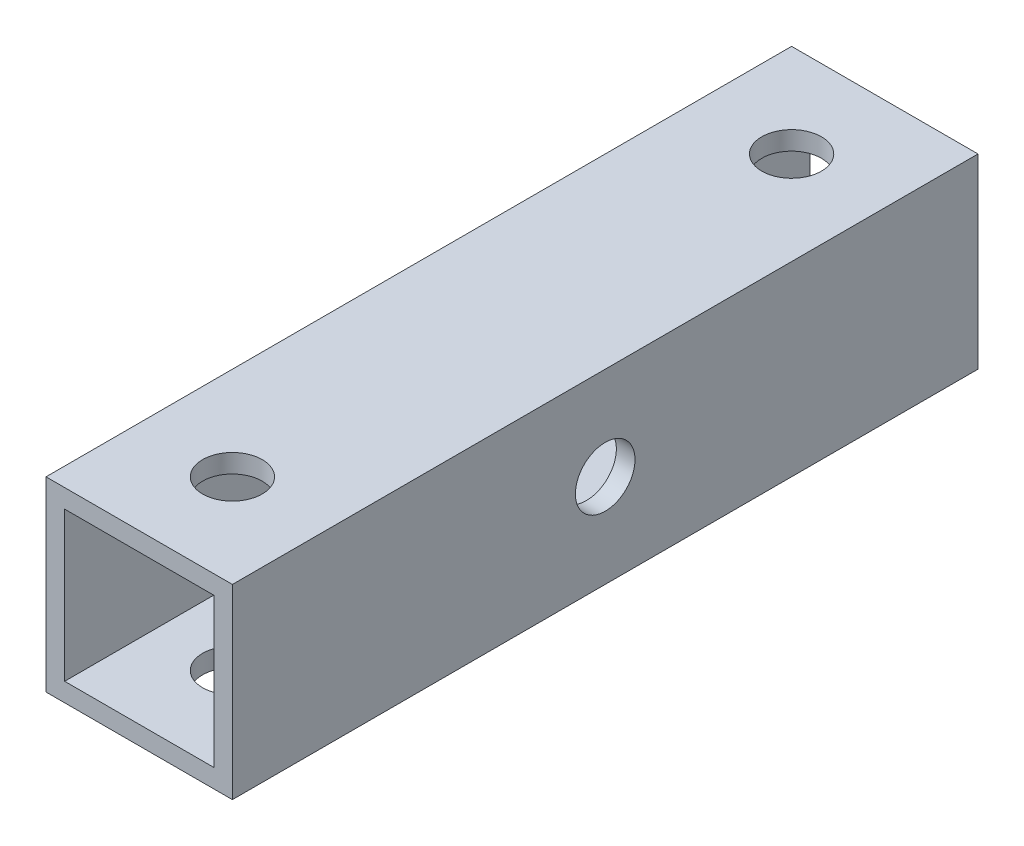
ISO-10303-21;
HEADER;
FILE_DESCRIPTION(('STEP AP214'),'2;1');
FILE_NAME('part.step','',(''),(''),'','','');
FILE_SCHEMA(('AUTOMOTIVE_DESIGN { 1 0 10303 214 1 1 1 1 }'));
ENDSEC;
DATA;
#1=APPLICATION_CONTEXT('core data for automotive mechanical design processes');
#2=APPLICATION_PROTOCOL_DEFINITION('international standard','automotive_design',2000,#1);
#3=PRODUCT_CONTEXT('',#1,'mechanical');
#4=PRODUCT('Part','Part','',(#3));
#5=PRODUCT_RELATED_PRODUCT_CATEGORY('part','',(#4));
#6=PRODUCT_DEFINITION_FORMATION('','',#4);
#7=PRODUCT_DEFINITION_CONTEXT('part definition',#1,'design');
#8=PRODUCT_DEFINITION('design','',#6,#7);
#9=PRODUCT_DEFINITION_SHAPE('','',#8);
#10=(LENGTH_UNIT() NAMED_UNIT(*) SI_UNIT(.MILLI.,.METRE.));
#11=(NAMED_UNIT(*) PLANE_ANGLE_UNIT() SI_UNIT($,.RADIAN.));
#12=(NAMED_UNIT(*) SI_UNIT($,.STERADIAN.) SOLID_ANGLE_UNIT());
#13=UNCERTAINTY_MEASURE_WITH_UNIT(LENGTH_MEASURE(1.E-05),#10,'distance_accuracy_value','');
#14=(GEOMETRIC_REPRESENTATION_CONTEXT(3) GLOBAL_UNCERTAINTY_ASSIGNED_CONTEXT((#13)) GLOBAL_UNIT_ASSIGNED_CONTEXT((#10,
#11,#12)) REPRESENTATION_CONTEXT('',''));
#15=CARTESIAN_POINT('',(0.,0.,0.));
#16=DIRECTION('',(0.,0.,1.));
#17=DIRECTION('',(1.,0.,0.));
#18=AXIS2_PLACEMENT_3D('',#15,#16,#17);
#19=CARTESIAN_POINT('',(0.,0.,40.));
#20=DIRECTION('',(0.,0.,1.));
#21=DIRECTION('',(1.,0.,0.));
#22=AXIS2_PLACEMENT_3D('',#19,#20,#21);
#23=PLANE('',#22);
#24=DIRECTION('',(0.,1.,0.));
#25=VECTOR('',#24,1.);
#26=CARTESIAN_POINT('',(5.,5.,40.));
#27=LINE('',#26,#25);
#28=CARTESIAN_POINT('',(5.,-5.,40.));
#29=VERTEX_POINT('',#28);
#30=CARTESIAN_POINT('',(5.,5.,40.));
#31=VERTEX_POINT('',#30);
#32=EDGE_CURVE('E138',#29,#31,#27,.T.);
#33=ORIENTED_EDGE('',*,*,#32,.T.);
#34=DIRECTION('',(-1.,0.,0.));
#35=VECTOR('',#34,1.);
#36=CARTESIAN_POINT('',(-5.,5.,40.));
#37=LINE('',#36,#35);
#38=CARTESIAN_POINT('',(-5.,5.,40.));
#39=VERTEX_POINT('',#38);
#40=EDGE_CURVE('E141',#31,#39,#37,.T.);
#41=ORIENTED_EDGE('',*,*,#40,.T.);
#42=DIRECTION('',(0.,-1.,0.));
#43=VECTOR('',#42,1.);
#44=CARTESIAN_POINT('',(-5.,5.,40.));
#45=LINE('',#44,#43);
#46=CARTESIAN_POINT('',(-5.,-5.,40.));
#47=VERTEX_POINT('',#46);
#48=EDGE_CURVE('E144',#39,#47,#45,.T.);
#49=ORIENTED_EDGE('',*,*,#48,.T.);
#50=DIRECTION('',(1.,0.,0.));
#51=VECTOR('',#50,1.);
#52=CARTESIAN_POINT('',(-5.,-5.,40.));
#53=LINE('',#52,#51);
#54=EDGE_CURVE('E146',#47,#29,#53,.T.);
#55=ORIENTED_EDGE('',*,*,#54,.T.);
#56=EDGE_LOOP('',(#33,#41,#49,#55));
#57=FACE_BOUND('',#56,.T.);
#58=DIRECTION('',(0.,-1.,0.));
#59=VECTOR('',#58,1.);
#60=CARTESIAN_POINT('',(-4.,4.,40.));
#61=LINE('',#60,#59);
#62=CARTESIAN_POINT('',(-4.,4.,40.));
#63=VERTEX_POINT('',#62);
#64=CARTESIAN_POINT('',(-4.,-4.,40.));
#65=VERTEX_POINT('',#64);
#66=EDGE_CURVE('E108',#63,#65,#61,.T.);
#67=ORIENTED_EDGE('',*,*,#66,.F.);
#68=DIRECTION('',(-1.,0.,0.));
#69=VECTOR('',#68,1.);
#70=CARTESIAN_POINT('',(-4.,4.,40.));
#71=LINE('',#70,#69);
#72=CARTESIAN_POINT('',(4.,4.,40.));
#73=VERTEX_POINT('',#72);
#74=EDGE_CURVE('E100',#73,#63,#71,.T.);
#75=ORIENTED_EDGE('',*,*,#74,.F.);
#76=DIRECTION('',(0.,1.,0.));
#77=VECTOR('',#76,1.);
#78=CARTESIAN_POINT('',(4.,4.,40.));
#79=LINE('',#78,#77);
#80=CARTESIAN_POINT('',(4.,-4.,40.));
#81=VERTEX_POINT('',#80);
#82=EDGE_CURVE('E122',#81,#73,#79,.T.);
#83=ORIENTED_EDGE('',*,*,#82,.F.);
#84=DIRECTION('',(1.,0.,0.));
#85=VECTOR('',#84,1.);
#86=CARTESIAN_POINT('',(-4.,-4.,40.));
#87=LINE('',#86,#85);
#88=EDGE_CURVE('E120',#65,#81,#87,.T.);
#89=ORIENTED_EDGE('',*,*,#88,.F.);
#90=EDGE_LOOP('',(#67,#75,#83,#89));
#91=FACE_BOUND('',#90,.T.);
#92=ADVANCED_FACE('F33',(#57,#91),#23,.T.);
#93=CARTESIAN_POINT('',(0.,0.,0.));
#94=DIRECTION('',(0.,0.,1.));
#95=DIRECTION('',(1.,0.,0.));
#96=AXIS2_PLACEMENT_3D('',#93,#94,#95);
#97=PLANE('',#96);
#98=DIRECTION('',(0.,1.,0.));
#99=VECTOR('',#98,1.);
#100=CARTESIAN_POINT('',(5.,5.,0.));
#101=LINE('',#100,#99);
#102=CARTESIAN_POINT('',(5.,-5.,0.));
#103=VERTEX_POINT('',#102);
#104=CARTESIAN_POINT('',(5.,5.,0.));
#105=VERTEX_POINT('',#104);
#106=EDGE_CURVE('E116',#103,#105,#101,.T.);
#107=ORIENTED_EDGE('',*,*,#106,.F.);
#108=DIRECTION('',(1.,0.,0.));
#109=VECTOR('',#108,1.);
#110=CARTESIAN_POINT('',(-5.,-5.,0.));
#111=LINE('',#110,#109);
#112=CARTESIAN_POINT('',(-5.,-5.,0.));
#113=VERTEX_POINT('',#112);
#114=EDGE_CURVE('E142',#113,#103,#111,.T.);
#115=ORIENTED_EDGE('',*,*,#114,.F.);
#116=DIRECTION('',(0.,-1.,0.));
#117=VECTOR('',#116,1.);
#118=CARTESIAN_POINT('',(-5.,5.,0.));
#119=LINE('',#118,#117);
#120=CARTESIAN_POINT('',(-5.,5.,0.));
#121=VERTEX_POINT('',#120);
#122=EDGE_CURVE('E153',#121,#113,#119,.T.);
#123=ORIENTED_EDGE('',*,*,#122,.F.);
#124=DIRECTION('',(-1.,0.,0.));
#125=VECTOR('',#124,1.);
#126=CARTESIAN_POINT('',(-5.,5.,0.));
#127=LINE('',#126,#125);
#128=EDGE_CURVE('E151',#105,#121,#127,.T.);
#129=ORIENTED_EDGE('',*,*,#128,.F.);
#130=EDGE_LOOP('',(#107,#115,#123,#129));
#131=FACE_BOUND('',#130,.T.);
#132=DIRECTION('',(-1.,0.,0.));
#133=VECTOR('',#132,1.);
#134=CARTESIAN_POINT('',(-4.,4.,0.));
#135=LINE('',#134,#133);
#136=CARTESIAN_POINT('',(4.,4.,0.));
#137=VERTEX_POINT('',#136);
#138=CARTESIAN_POINT('',(-4.,4.,0.));
#139=VERTEX_POINT('',#138);
#140=EDGE_CURVE('E58',#137,#139,#135,.T.);
#141=ORIENTED_EDGE('',*,*,#140,.T.);
#142=DIRECTION('',(0.,-1.,0.));
#143=VECTOR('',#142,1.);
#144=CARTESIAN_POINT('',(-4.,4.,0.));
#145=LINE('',#144,#143);
#146=CARTESIAN_POINT('',(-4.,-4.,0.));
#147=VERTEX_POINT('',#146);
#148=EDGE_CURVE('E115',#139,#147,#145,.T.);
#149=ORIENTED_EDGE('',*,*,#148,.T.);
#150=DIRECTION('',(1.,0.,0.));
#151=VECTOR('',#150,1.);
#152=CARTESIAN_POINT('',(-4.,-4.,0.));
#153=LINE('',#152,#151);
#154=CARTESIAN_POINT('',(4.,-4.,0.));
#155=VERTEX_POINT('',#154);
#156=EDGE_CURVE('E130',#147,#155,#153,.T.);
#157=ORIENTED_EDGE('',*,*,#156,.T.);
#158=DIRECTION('',(0.,1.,0.));
#159=VECTOR('',#158,1.);
#160=CARTESIAN_POINT('',(4.,4.,0.));
#161=LINE('',#160,#159);
#162=EDGE_CURVE('E109',#155,#137,#161,.T.);
#163=ORIENTED_EDGE('',*,*,#162,.T.);
#164=EDGE_LOOP('',(#141,#149,#157,#163));
#165=FACE_BOUND('',#164,.T.);
#166=ADVANCED_FACE('F213',(#131,#165),#97,.F.);
#167=CARTESIAN_POINT('',(5.,5.,40.));
#168=DIRECTION('',(-1.,0.,0.));
#169=DIRECTION('',(0.,-1.,0.));
#170=AXIS2_PLACEMENT_3D('',#167,#168,#169);
#171=PLANE('',#170);
#172=CARTESIAN_POINT('',(5.,0.,20.));
#173=DIRECTION('',(1.,0.,0.));
#174=DIRECTION('',(0.,1.,0.));
#175=AXIS2_PLACEMENT_3D('',#172,#173,#174);
#176=CIRCLE('',#175,1.60000000000001);
#177=CARTESIAN_POINT('',(5.,1.60000000000001,20.));
#178=VERTEX_POINT('',#177);
#179=EDGE_CURVE('E278',#178,#178,#176,.T.);
#180=ORIENTED_EDGE('',*,*,#179,.F.);
#181=EDGE_LOOP('',(#180));
#182=FACE_BOUND('',#181,.T.);
#183=ORIENTED_EDGE('',*,*,#106,.T.);
#184=DIRECTION('',(0.,0.,-1.));
#185=VECTOR('',#184,1.);
#186=CARTESIAN_POINT('',(5.,5.,40.));
#187=LINE('',#186,#185);
#188=EDGE_CURVE('E11',#31,#105,#187,.T.);
#189=ORIENTED_EDGE('',*,*,#188,.F.);
#190=ORIENTED_EDGE('',*,*,#32,.F.);
#191=DIRECTION('',(0.,0.,-1.));
#192=VECTOR('',#191,1.);
#193=CARTESIAN_POINT('',(5.,-5.,40.));
#194=LINE('',#193,#192);
#195=EDGE_CURVE('E148',#29,#103,#194,.T.);
#196=ORIENTED_EDGE('',*,*,#195,.T.);
#197=EDGE_LOOP('',(#183,#189,#190,#196));
#198=FACE_BOUND('',#197,.T.);
#199=ADVANCED_FACE('F35',(#182,#198),#171,.F.);
#200=CARTESIAN_POINT('',(-5.,5.,40.));
#201=DIRECTION('',(0.,-1.,0.));
#202=DIRECTION('',(0.,0.,-1.));
#203=AXIS2_PLACEMENT_3D('',#200,#201,#202);
#204=PLANE('',#203);
#205=CARTESIAN_POINT('',(0.,5.,35.));
#206=DIRECTION('',(0.,1.,0.));
#207=DIRECTION('',(0.,0.,1.));
#208=AXIS2_PLACEMENT_3D('',#205,#206,#207);
#209=CIRCLE('',#208,1.6);
#210=CARTESIAN_POINT('',(0.,5.,36.6));
#211=VERTEX_POINT('',#210);
#212=EDGE_CURVE('E170',#211,#211,#209,.T.);
#213=ORIENTED_EDGE('',*,*,#212,.F.);
#214=EDGE_LOOP('',(#213));
#215=FACE_BOUND('',#214,.T.);
#216=CARTESIAN_POINT('',(0.,5.,5.));
#217=DIRECTION('',(0.,1.,0.));
#218=DIRECTION('',(0.,0.,1.));
#219=AXIS2_PLACEMENT_3D('',#216,#217,#218);
#220=CIRCLE('',#219,1.6);
#221=CARTESIAN_POINT('',(0.,5.,6.6));
#222=VERTEX_POINT('',#221);
#223=EDGE_CURVE('E166',#222,#222,#220,.T.);
#224=ORIENTED_EDGE('',*,*,#223,.F.);
#225=EDGE_LOOP('',(#224));
#226=FACE_BOUND('',#225,.T.);
#227=ORIENTED_EDGE('',*,*,#128,.T.);
#228=DIRECTION('',(0.,0.,-1.));
#229=VECTOR('',#228,1.);
#230=CARTESIAN_POINT('',(-5.,5.,40.));
#231=LINE('',#230,#229);
#232=EDGE_CURVE('E42',#39,#121,#231,.T.);
#233=ORIENTED_EDGE('',*,*,#232,.F.);
#234=ORIENTED_EDGE('',*,*,#40,.F.);
#235=ORIENTED_EDGE('',*,*,#188,.T.);
#236=EDGE_LOOP('',(#227,#233,#234,#235));
#237=FACE_BOUND('',#236,.T.);
#238=ADVANCED_FACE('F229',(#215,#226,#237),#204,.F.);
#239=CARTESIAN_POINT('',(-5.,5.,40.));
#240=DIRECTION('',(1.,0.,0.));
#241=DIRECTION('',(0.,1.,0.));
#242=AXIS2_PLACEMENT_3D('',#239,#240,#241);
#243=PLANE('',#242);
#244=CARTESIAN_POINT('',(-5.,0.,20.));
#245=DIRECTION('',(1.,0.,0.));
#246=DIRECTION('',(0.,1.,0.));
#247=AXIS2_PLACEMENT_3D('',#244,#245,#246);
#248=CIRCLE('',#247,1.60000000000001);
#249=CARTESIAN_POINT('',(-5.,1.6,20.));
#250=VERTEX_POINT('',#249);
#251=EDGE_CURVE('E277',#250,#250,#248,.T.);
#252=ORIENTED_EDGE('',*,*,#251,.T.);
#253=EDGE_LOOP('',(#252));
#254=FACE_BOUND('',#253,.T.);
#255=ORIENTED_EDGE('',*,*,#122,.T.);
#256=DIRECTION('',(0.,0.,-1.));
#257=VECTOR('',#256,1.);
#258=CARTESIAN_POINT('',(-5.,-5.,40.));
#259=LINE('',#258,#257);
#260=EDGE_CURVE('E158',#47,#113,#259,.T.);
#261=ORIENTED_EDGE('',*,*,#260,.F.);
#262=ORIENTED_EDGE('',*,*,#48,.F.);
#263=ORIENTED_EDGE('',*,*,#232,.T.);
#264=EDGE_LOOP('',(#255,#261,#262,#263));
#265=FACE_BOUND('',#264,.T.);
#266=ADVANCED_FACE('F226',(#254,#265),#243,.F.);
#267=CARTESIAN_POINT('',(-5.,-5.,40.));
#268=DIRECTION('',(0.,1.,0.));
#269=DIRECTION('',(0.,0.,1.));
#270=AXIS2_PLACEMENT_3D('',#267,#268,#269);
#271=PLANE('',#270);
#272=CARTESIAN_POINT('',(0.,-5.,35.));
#273=DIRECTION('',(0.,1.,0.));
#274=DIRECTION('',(0.,0.,1.));
#275=AXIS2_PLACEMENT_3D('',#272,#273,#274);
#276=CIRCLE('',#275,1.6);
#277=CARTESIAN_POINT('',(0.,-5.,36.6));
#278=VERTEX_POINT('',#277);
#279=EDGE_CURVE('E174',#278,#278,#276,.T.);
#280=ORIENTED_EDGE('',*,*,#279,.T.);
#281=EDGE_LOOP('',(#280));
#282=FACE_BOUND('',#281,.T.);
#283=CARTESIAN_POINT('',(0.,-5.,5.));
#284=DIRECTION('',(0.,1.,0.));
#285=DIRECTION('',(0.,0.,1.));
#286=AXIS2_PLACEMENT_3D('',#283,#284,#285);
#287=CIRCLE('',#286,1.6);
#288=CARTESIAN_POINT('',(0.,-5.,6.6));
#289=VERTEX_POINT('',#288);
#290=EDGE_CURVE('E128',#289,#289,#287,.T.);
#291=ORIENTED_EDGE('',*,*,#290,.T.);
#292=EDGE_LOOP('',(#291));
#293=FACE_BOUND('',#292,.T.);
#294=ORIENTED_EDGE('',*,*,#114,.T.);
#295=ORIENTED_EDGE('',*,*,#195,.F.);
#296=ORIENTED_EDGE('',*,*,#54,.F.);
#297=ORIENTED_EDGE('',*,*,#260,.T.);
#298=EDGE_LOOP('',(#294,#295,#296,#297));
#299=FACE_BOUND('',#298,.T.);
#300=ADVANCED_FACE('F193',(#282,#293,#299),#271,.F.);
#301=CARTESIAN_POINT('',(-4.,4.,40.));
#302=DIRECTION('',(0.,-1.,0.));
#303=DIRECTION('',(0.,0.,-1.));
#304=AXIS2_PLACEMENT_3D('',#301,#302,#303);
#305=PLANE('',#304);
#306=CARTESIAN_POINT('',(0.,4.,35.));
#307=DIRECTION('',(0.,-1.,0.));
#308=DIRECTION('',(0.,0.,-1.));
#309=AXIS2_PLACEMENT_3D('',#306,#307,#308);
#310=CIRCLE('',#309,1.6);
#311=CARTESIAN_POINT('',(0.,4.,33.4));
#312=VERTEX_POINT('',#311);
#313=EDGE_CURVE('E169',#312,#312,#310,.T.);
#314=ORIENTED_EDGE('',*,*,#313,.F.);
#315=EDGE_LOOP('',(#314));
#316=FACE_BOUND('',#315,.T.);
#317=CARTESIAN_POINT('',(0.,4.,5.));
#318=DIRECTION('',(0.,-1.,0.));
#319=DIRECTION('',(0.,0.,-1.));
#320=AXIS2_PLACEMENT_3D('',#317,#318,#319);
#321=CIRCLE('',#320,1.6);
#322=CARTESIAN_POINT('',(0.,4.,3.4));
#323=VERTEX_POINT('',#322);
#324=EDGE_CURVE('E165',#323,#323,#321,.T.);
#325=ORIENTED_EDGE('',*,*,#324,.F.);
#326=EDGE_LOOP('',(#325));
#327=FACE_BOUND('',#326,.T.);
#328=ORIENTED_EDGE('',*,*,#140,.F.);
#329=DIRECTION('',(0.,0.,-1.));
#330=VECTOR('',#329,1.);
#331=CARTESIAN_POINT('',(4.,4.,40.));
#332=LINE('',#331,#330);
#333=EDGE_CURVE('E104',#73,#137,#332,.T.);
#334=ORIENTED_EDGE('',*,*,#333,.F.);
#335=ORIENTED_EDGE('',*,*,#74,.T.);
#336=DIRECTION('',(0.,0.,-1.));
#337=VECTOR('',#336,1.);
#338=CARTESIAN_POINT('',(-4.,4.,40.));
#339=LINE('',#338,#337);
#340=EDGE_CURVE('E103',#63,#139,#339,.T.);
#341=ORIENTED_EDGE('',*,*,#340,.T.);
#342=EDGE_LOOP('',(#328,#334,#335,#341));
#343=FACE_BOUND('',#342,.T.);
#344=ADVANCED_FACE('F102',(#316,#327,#343),#305,.T.);
#345=CARTESIAN_POINT('',(-4.,4.,40.));
#346=DIRECTION('',(1.,0.,0.));
#347=DIRECTION('',(0.,1.,0.));
#348=AXIS2_PLACEMENT_3D('',#345,#346,#347);
#349=PLANE('',#348);
#350=CARTESIAN_POINT('',(-4.,0.,20.));
#351=DIRECTION('',(1.,0.,0.));
#352=DIRECTION('',(0.,1.,0.));
#353=AXIS2_PLACEMENT_3D('',#350,#351,#352);
#354=CIRCLE('',#353,1.60000000000001);
#355=CARTESIAN_POINT('',(-4.,1.6,20.));
#356=VERTEX_POINT('',#355);
#357=EDGE_CURVE('E177',#356,#356,#354,.T.);
#358=ORIENTED_EDGE('',*,*,#357,.F.);
#359=EDGE_LOOP('',(#358));
#360=FACE_BOUND('',#359,.T.);
#361=ORIENTED_EDGE('',*,*,#148,.F.);
#362=ORIENTED_EDGE('',*,*,#340,.F.);
#363=ORIENTED_EDGE('',*,*,#66,.T.);
#364=DIRECTION('',(0.,0.,-1.));
#365=VECTOR('',#364,1.);
#366=CARTESIAN_POINT('',(-4.,-4.,40.));
#367=LINE('',#366,#365);
#368=EDGE_CURVE('E117',#65,#147,#367,.T.);
#369=ORIENTED_EDGE('',*,*,#368,.T.);
#370=EDGE_LOOP('',(#361,#362,#363,#369));
#371=FACE_BOUND('',#370,.T.);
#372=ADVANCED_FACE('F112',(#360,#371),#349,.T.);
#373=CARTESIAN_POINT('',(-4.,-4.,40.));
#374=DIRECTION('',(0.,1.,0.));
#375=DIRECTION('',(-1.,0.,0.));
#376=AXIS2_PLACEMENT_3D('',#373,#374,#375);
#377=PLANE('',#376);
#378=CARTESIAN_POINT('',(0.,-4.,35.));
#379=DIRECTION('',(0.,1.,0.));
#380=DIRECTION('',(-1.,0.,0.));
#381=AXIS2_PLACEMENT_3D('',#378,#379,#380);
#382=CIRCLE('',#381,1.6);
#383=CARTESIAN_POINT('',(-1.6,-4.,35.));
#384=VERTEX_POINT('',#383);
#385=EDGE_CURVE('E167',#384,#384,#382,.T.);
#386=ORIENTED_EDGE('',*,*,#385,.F.);
#387=EDGE_LOOP('',(#386));
#388=FACE_BOUND('',#387,.T.);
#389=CARTESIAN_POINT('',(0.,-4.,5.));
#390=DIRECTION('',(0.,1.,0.));
#391=DIRECTION('',(-1.,0.,0.));
#392=AXIS2_PLACEMENT_3D('',#389,#390,#391);
#393=CIRCLE('',#392,1.6);
#394=CARTESIAN_POINT('',(-1.6,-4.,5.));
#395=VERTEX_POINT('',#394);
#396=EDGE_CURVE('E163',#395,#395,#393,.T.);
#397=ORIENTED_EDGE('',*,*,#396,.F.);
#398=EDGE_LOOP('',(#397));
#399=FACE_BOUND('',#398,.T.);
#400=ORIENTED_EDGE('',*,*,#156,.F.);
#401=ORIENTED_EDGE('',*,*,#368,.F.);
#402=ORIENTED_EDGE('',*,*,#88,.T.);
#403=DIRECTION('',(0.,0.,-1.));
#404=VECTOR('',#403,1.);
#405=CARTESIAN_POINT('',(4.,-4.,40.));
#406=LINE('',#405,#404);
#407=EDGE_CURVE('E50',#81,#155,#406,.T.);
#408=ORIENTED_EDGE('',*,*,#407,.T.);
#409=EDGE_LOOP('',(#400,#401,#402,#408));
#410=FACE_BOUND('',#409,.T.);
#411=ADVANCED_FACE('F208',(#388,#399,#410),#377,.T.);
#412=CARTESIAN_POINT('',(4.,4.,40.));
#413=DIRECTION('',(-1.,0.,0.));
#414=DIRECTION('',(0.,-1.,0.));
#415=AXIS2_PLACEMENT_3D('',#412,#413,#414);
#416=PLANE('',#415);
#417=CARTESIAN_POINT('',(4.,0.,20.));
#418=DIRECTION('',(-1.,0.,0.));
#419=DIRECTION('',(0.,-1.,0.));
#420=AXIS2_PLACEMENT_3D('',#417,#418,#419);
#421=CIRCLE('',#420,1.60000000000001);
#422=CARTESIAN_POINT('',(4.,-1.6,20.));
#423=VERTEX_POINT('',#422);
#424=EDGE_CURVE('E37',#423,#423,#421,.T.);
#425=ORIENTED_EDGE('',*,*,#424,.F.);
#426=EDGE_LOOP('',(#425));
#427=FACE_BOUND('',#426,.T.);
#428=ORIENTED_EDGE('',*,*,#162,.F.);
#429=ORIENTED_EDGE('',*,*,#407,.F.);
#430=ORIENTED_EDGE('',*,*,#82,.T.);
#431=ORIENTED_EDGE('',*,*,#333,.T.);
#432=EDGE_LOOP('',(#428,#429,#430,#431));
#433=FACE_BOUND('',#432,.T.);
#434=ADVANCED_FACE('F199',(#427,#433),#416,.T.);
#435=CARTESIAN_POINT('',(0.,-403.37168574,5.));
#436=DIRECTION('',(0.,1.,0.));
#437=DIRECTION('',(0.,0.,1.));
#438=AXIS2_PLACEMENT_3D('',#435,#436,#437);
#439=CYLINDRICAL_SURFACE('',#438,1.6);
#440=ORIENTED_EDGE('',*,*,#396,.T.);
#441=EDGE_LOOP('',(#440));
#442=FACE_BOUND('',#441,.T.);
#443=ORIENTED_EDGE('',*,*,#290,.F.);
#444=EDGE_LOOP('',(#443));
#445=FACE_BOUND('',#444,.T.);
#446=ADVANCED_FACE('F196',(#442,#445),#439,.F.);
#447=ORIENTED_EDGE('',*,*,#324,.T.);
#448=EDGE_LOOP('',(#447));
#449=FACE_BOUND('',#448,.T.);
#450=ORIENTED_EDGE('',*,*,#223,.T.);
#451=EDGE_LOOP('',(#450));
#452=FACE_BOUND('',#451,.T.);
#453=ADVANCED_FACE('F198',(#449,#452),#439,.F.);
#454=CARTESIAN_POINT('',(0.,-403.37168574,35.));
#455=DIRECTION('',(0.,1.,0.));
#456=DIRECTION('',(0.,0.,1.));
#457=AXIS2_PLACEMENT_3D('',#454,#455,#456);
#458=CYLINDRICAL_SURFACE('',#457,1.6);
#459=ORIENTED_EDGE('',*,*,#385,.T.);
#460=EDGE_LOOP('',(#459));
#461=FACE_BOUND('',#460,.T.);
#462=ORIENTED_EDGE('',*,*,#279,.F.);
#463=EDGE_LOOP('',(#462));
#464=FACE_BOUND('',#463,.T.);
#465=ADVANCED_FACE('F206',(#461,#464),#458,.F.);
#466=ORIENTED_EDGE('',*,*,#313,.T.);
#467=EDGE_LOOP('',(#466));
#468=FACE_BOUND('',#467,.T.);
#469=ORIENTED_EDGE('',*,*,#212,.T.);
#470=EDGE_LOOP('',(#469));
#471=FACE_BOUND('',#470,.T.);
#472=ADVANCED_FACE('F285',(#468,#471),#458,.F.);
#473=CARTESIAN_POINT('',(-5.,0.,20.));
#474=DIRECTION('',(1.,0.,0.));
#475=DIRECTION('',(0.,1.,0.));
#476=AXIS2_PLACEMENT_3D('',#473,#474,#475);
#477=CYLINDRICAL_SURFACE('',#476,1.60000000000001);
#478=ORIENTED_EDGE('',*,*,#424,.T.);
#479=EDGE_LOOP('',(#478));
#480=FACE_BOUND('',#479,.T.);
#481=ORIENTED_EDGE('',*,*,#179,.T.);
#482=EDGE_LOOP('',(#481));
#483=FACE_BOUND('',#482,.T.);
#484=ADVANCED_FACE('F273',(#480,#483),#477,.F.);
#485=ORIENTED_EDGE('',*,*,#357,.T.);
#486=EDGE_LOOP('',(#485));
#487=FACE_BOUND('',#486,.T.);
#488=ORIENTED_EDGE('',*,*,#251,.F.);
#489=EDGE_LOOP('',(#488));
#490=FACE_BOUND('',#489,.T.);
#491=ADVANCED_FACE('F270',(#487,#490),#477,.F.);
#492=CLOSED_SHELL('',(#92,#166,#199,#238,#266,#300,#344,#372,#411,#434,#446,#453,#465,#472,#484,#491));
#493=MANIFOLD_SOLID_BREP('B2',#492);
#494=ADVANCED_BREP_SHAPE_REPRESENTATION('',(#18,#493),#14);
#495=SHAPE_DEFINITION_REPRESENTATION(#9,#494);
ENDSEC;
END-ISO-10303-21;
